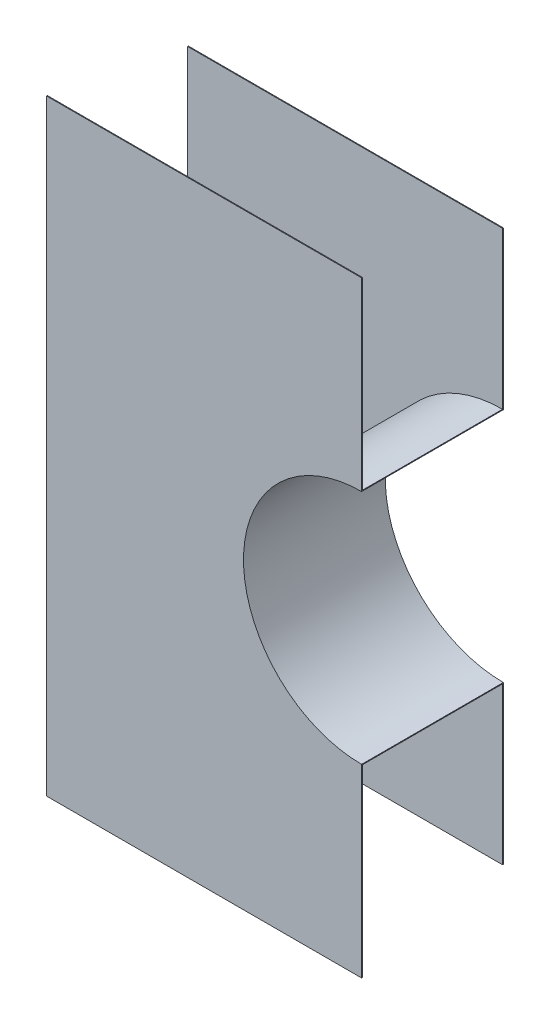
ISO-10303-21;
HEADER;
FILE_DESCRIPTION(('STEP AP214'),'2;1');
FILE_NAME('part.step','',(''),(''),'','','');
FILE_SCHEMA(('AUTOMOTIVE_DESIGN { 1 0 10303 214 1 1 1 1 }'));
ENDSEC;
DATA;
#1=APPLICATION_CONTEXT('core data for automotive mechanical design processes');
#2=APPLICATION_PROTOCOL_DEFINITION('international standard','automotive_design',2000,#1);
#3=PRODUCT_CONTEXT('',#1,'mechanical');
#4=PRODUCT('Part','Part','',(#3));
#5=PRODUCT_RELATED_PRODUCT_CATEGORY('part','',(#4));
#6=PRODUCT_DEFINITION_FORMATION('','',#4);
#7=PRODUCT_DEFINITION_CONTEXT('part definition',#1,'design');
#8=PRODUCT_DEFINITION('design','',#6,#7);
#9=PRODUCT_DEFINITION_SHAPE('','',#8);
#10=(LENGTH_UNIT() NAMED_UNIT(*) SI_UNIT(.MILLI.,.METRE.));
#11=(NAMED_UNIT(*) PLANE_ANGLE_UNIT() SI_UNIT($,.RADIAN.));
#12=(NAMED_UNIT(*) SI_UNIT($,.STERADIAN.) SOLID_ANGLE_UNIT());
#13=UNCERTAINTY_MEASURE_WITH_UNIT(LENGTH_MEASURE(1.E-05),#10,'distance_accuracy_value','');
#14=(GEOMETRIC_REPRESENTATION_CONTEXT(3) GLOBAL_UNCERTAINTY_ASSIGNED_CONTEXT((#13)) GLOBAL_UNIT_ASSIGNED_CONTEXT((#10,
#11,#12)) REPRESENTATION_CONTEXT('',''));
#15=CARTESIAN_POINT('',(0.,0.,0.));
#16=DIRECTION('',(0.,0.,1.));
#17=DIRECTION('',(1.,0.,0.));
#18=AXIS2_PLACEMENT_3D('',#15,#16,#17);
#19=CARTESIAN_POINT('',(-0.009636568954392,0.,0.18));
#20=DIRECTION('',(0.,0.,1.));
#21=DIRECTION('',(1.,0.,0.));
#22=AXIS2_PLACEMENT_3D('',#19,#20,#21);
#23=PLANE('',#22);
#24=DIRECTION('',(-1.,0.,0.));
#25=VECTOR('',#24,1.);
#26=CARTESIAN_POINT('',(-0.2,0.385,0.18));
#27=LINE('',#26,#25);
#28=CARTESIAN_POINT('',(0.2,0.385,0.18));
#29=VERTEX_POINT('',#28);
#30=CARTESIAN_POINT('',(-0.2,0.385,0.18));
#31=VERTEX_POINT('',#30);
#32=EDGE_CURVE('E257',#29,#31,#27,.T.);
#33=ORIENTED_EDGE('',*,*,#32,.T.);
#34=DIRECTION('',(0.,-1.,0.));
#35=VECTOR('',#34,1.);
#36=CARTESIAN_POINT('',(-0.2,-0.385,0.18));
#37=LINE('',#36,#35);
#38=CARTESIAN_POINT('',(-0.2,-0.385,0.18));
#39=VERTEX_POINT('',#38);
#40=EDGE_CURVE('E11',#31,#39,#37,.T.);
#41=ORIENTED_EDGE('',*,*,#40,.T.);
#42=DIRECTION('',(1.,0.,0.));
#43=VECTOR('',#42,1.);
#44=CARTESIAN_POINT('',(0.2,-0.385,0.18));
#45=LINE('',#44,#43);
#46=CARTESIAN_POINT('',(0.2,-0.385,0.18));
#47=VERTEX_POINT('',#46);
#48=EDGE_CURVE('E263',#39,#47,#45,.T.);
#49=ORIENTED_EDGE('',*,*,#48,.T.);
#50=DIRECTION('',(0.,1.,0.));
#51=VECTOR('',#50,1.);
#52=CARTESIAN_POINT('',(0.2,-0.15,0.18));
#53=LINE('',#52,#51);
#54=CARTESIAN_POINT('',(0.2,-0.15,0.18));
#55=VERTEX_POINT('',#54);
#56=EDGE_CURVE('E208',#47,#55,#53,.T.);
#57=ORIENTED_EDGE('',*,*,#56,.T.);
#58=CARTESIAN_POINT('',(0.2,0.,0.18));
#59=DIRECTION('',(0.,0.,-1.));
#60=DIRECTION('',(0.,1.,0.));
#61=AXIS2_PLACEMENT_3D('',#58,#59,#60);
#62=CIRCLE('',#61,0.15);
#63=CARTESIAN_POINT('',(0.2,0.15,0.18));
#64=VERTEX_POINT('',#63);
#65=EDGE_CURVE('E260',#55,#64,#62,.T.);
#66=ORIENTED_EDGE('',*,*,#65,.T.);
#67=DIRECTION('',(0.,1.,0.));
#68=VECTOR('',#67,1.);
#69=CARTESIAN_POINT('',(0.2,0.385,0.18));
#70=LINE('',#69,#68);
#71=EDGE_CURVE('E178',#64,#29,#70,.T.);
#72=ORIENTED_EDGE('',*,*,#71,.T.);
#73=EDGE_LOOP('',(#33,#41,#49,#57,#66,#72));
#74=FACE_BOUND('',#73,.T.);
#75=ADVANCED_FACE('F17',(#74),#23,.T.);
#76=CARTESIAN_POINT('',(-0.2,0.385,0.));
#77=DIRECTION('',(-1.,0.,0.));
#78=DIRECTION('',(0.,1.,0.));
#79=AXIS2_PLACEMENT_3D('',#76,#77,#78);
#80=PLANE('',#79);
#81=DIRECTION('',(0.,-1.,0.));
#82=VECTOR('',#81,1.);
#83=CARTESIAN_POINT('',(-0.2,0.1925,0.179));
#84=LINE('',#83,#82);
#85=CARTESIAN_POINT('',(-0.2,0.385,0.179));
#86=VERTEX_POINT('',#85);
#87=CARTESIAN_POINT('',(-0.2,-0.385,0.179));
#88=VERTEX_POINT('',#87);
#89=EDGE_CURVE('E241',#86,#88,#84,.T.);
#90=ORIENTED_EDGE('',*,*,#89,.T.);
#91=DIRECTION('',(0.,0.,1.));
#92=VECTOR('',#91,1.);
#93=CARTESIAN_POINT('',(-0.2,-0.385,0.));
#94=LINE('',#93,#92);
#95=EDGE_CURVE('E25',#88,#39,#94,.T.);
#96=ORIENTED_EDGE('',*,*,#95,.T.);
#97=ORIENTED_EDGE('',*,*,#40,.F.);
#98=DIRECTION('',(0.,0.,1.));
#99=VECTOR('',#98,1.);
#100=CARTESIAN_POINT('',(-0.2,0.385,0.));
#101=LINE('',#100,#99);
#102=EDGE_CURVE('E253',#86,#31,#101,.T.);
#103=ORIENTED_EDGE('',*,*,#102,.F.);
#104=EDGE_LOOP('',(#90,#96,#97,#103));
#105=FACE_BOUND('',#104,.T.);
#106=ADVANCED_FACE('F269',(#105),#80,.T.);
#107=CARTESIAN_POINT('',(-0.2,-0.385,0.));
#108=DIRECTION('',(0.,-1.,0.));
#109=DIRECTION('',(0.,0.,-1.));
#110=AXIS2_PLACEMENT_3D('',#107,#108,#109);
#111=PLANE('',#110);
#112=DIRECTION('',(1.,0.,0.));
#113=VECTOR('',#112,1.);
#114=CARTESIAN_POINT('',(-0.104818284477,-0.385,0.179));
#115=LINE('',#114,#113);
#116=CARTESIAN_POINT('',(0.2,-0.385,0.179));
#117=VERTEX_POINT('',#116);
#118=EDGE_CURVE('E238',#88,#117,#115,.T.);
#119=ORIENTED_EDGE('',*,*,#118,.T.);
#120=DIRECTION('',(0.,0.,1.));
#121=VECTOR('',#120,1.);
#122=CARTESIAN_POINT('',(0.2,-0.385,0.));
#123=LINE('',#122,#121);
#124=EDGE_CURVE('E220',#117,#47,#123,.T.);
#125=ORIENTED_EDGE('',*,*,#124,.T.);
#126=ORIENTED_EDGE('',*,*,#48,.F.);
#127=ORIENTED_EDGE('',*,*,#95,.F.);
#128=EDGE_LOOP('',(#119,#125,#126,#127));
#129=FACE_BOUND('',#128,.T.);
#130=ADVANCED_FACE('F273',(#129),#111,.T.);
#131=CARTESIAN_POINT('',(0.2,0.,0.));
#132=DIRECTION('',(0.,0.,1.));
#133=DIRECTION('',(0.,1.,0.));
#134=AXIS2_PLACEMENT_3D('',#131,#132,#133);
#135=CYLINDRICAL_SURFACE('',#134,0.15);
#136=CARTESIAN_POINT('',(0.2,0.,0.));
#137=DIRECTION('',(0.,0.,1.));
#138=DIRECTION('',(0.,1.,0.));
#139=AXIS2_PLACEMENT_3D('',#136,#137,#138);
#140=CIRCLE('',#139,0.15);
#141=CARTESIAN_POINT('',(0.2,0.15,0.));
#142=VERTEX_POINT('',#141);
#143=CARTESIAN_POINT('',(0.2,-0.15,0.));
#144=VERTEX_POINT('',#143);
#145=EDGE_CURVE('E235',#142,#144,#140,.T.);
#146=ORIENTED_EDGE('',*,*,#145,.F.);
#147=DIRECTION('',(0.,0.,1.));
#148=VECTOR('',#147,1.);
#149=CARTESIAN_POINT('',(0.2,0.15,0.));
#150=LINE('',#149,#148);
#151=EDGE_CURVE('E140',#142,#64,#150,.T.);
#152=ORIENTED_EDGE('',*,*,#151,.T.);
#153=ORIENTED_EDGE('',*,*,#65,.F.);
#154=DIRECTION('',(0.,0.,1.));
#155=VECTOR('',#154,1.);
#156=CARTESIAN_POINT('',(0.2,-0.15,0.));
#157=LINE('',#156,#155);
#158=EDGE_CURVE('E204',#144,#55,#157,.T.);
#159=ORIENTED_EDGE('',*,*,#158,.F.);
#160=EDGE_LOOP('',(#146,#152,#153,#159));
#161=FACE_BOUND('',#160,.T.);
#162=ADVANCED_FACE('F282',(#161),#135,.F.);
#163=CARTESIAN_POINT('',(-0.2,0.385,0.));
#164=DIRECTION('',(-1.,0.,0.));
#165=DIRECTION('',(0.,1.,0.));
#166=AXIS2_PLACEMENT_3D('',#163,#164,#165);
#167=PLANE('',#166);
#168=DIRECTION('',(0.,0.,-1.));
#169=VECTOR('',#168,1.);
#170=CARTESIAN_POINT('',(-0.2,0.35,0.));
#171=LINE('',#170,#169);
#172=CARTESIAN_POINT('',(-0.2,0.35,0.001));
#173=VERTEX_POINT('',#172);
#174=CARTESIAN_POINT('',(-0.2,0.35,0.));
#175=VERTEX_POINT('',#174);
#176=EDGE_CURVE('E154',#173,#175,#171,.T.);
#177=ORIENTED_EDGE('',*,*,#176,.T.);
#178=DIRECTION('',(0.,1.,0.));
#179=VECTOR('',#178,1.);
#180=CARTESIAN_POINT('',(-0.2,-0.385,0.));
#181=LINE('',#180,#179);
#182=CARTESIAN_POINT('',(-0.2,-0.35,0.));
#183=VERTEX_POINT('',#182);
#184=EDGE_CURVE('E149',#183,#175,#181,.T.);
#185=ORIENTED_EDGE('',*,*,#184,.F.);
#186=DIRECTION('',(0.,0.,1.));
#187=VECTOR('',#186,1.);
#188=CARTESIAN_POINT('',(-0.2,-0.35,0.));
#189=LINE('',#188,#187);
#190=CARTESIAN_POINT('',(-0.2,-0.35,0.001));
#191=VERTEX_POINT('',#190);
#192=EDGE_CURVE('E172',#183,#191,#189,.T.);
#193=ORIENTED_EDGE('',*,*,#192,.T.);
#194=DIRECTION('',(0.,1.,0.));
#195=VECTOR('',#194,1.);
#196=CARTESIAN_POINT('',(-0.2,0.1925,0.001));
#197=LINE('',#196,#195);
#198=EDGE_CURVE('E192',#191,#173,#197,.T.);
#199=ORIENTED_EDGE('',*,*,#198,.T.);
#200=EDGE_LOOP('',(#177,#185,#193,#199));
#201=FACE_BOUND('',#200,.T.);
#202=ADVANCED_FACE('F466',(#201),#167,.T.);
#203=CARTESIAN_POINT('',(0.2,0.385,0.));
#204=DIRECTION('',(0.,1.,0.));
#205=DIRECTION('',(1.,0.,0.));
#206=AXIS2_PLACEMENT_3D('',#203,#204,#205);
#207=PLANE('',#206);
#208=DIRECTION('',(-1.,0.,0.));
#209=VECTOR('',#208,1.);
#210=CARTESIAN_POINT('',(0.0951817155228,0.385,0.179));
#211=LINE('',#210,#209);
#212=CARTESIAN_POINT('',(0.2,0.385,0.179));
#213=VERTEX_POINT('',#212);
#214=EDGE_CURVE('E195',#213,#86,#211,.T.);
#215=ORIENTED_EDGE('',*,*,#214,.T.);
#216=ORIENTED_EDGE('',*,*,#102,.T.);
#217=ORIENTED_EDGE('',*,*,#32,.F.);
#218=DIRECTION('',(0.,0.,1.));
#219=VECTOR('',#218,1.);
#220=CARTESIAN_POINT('',(0.2,0.385,0.));
#221=LINE('',#220,#219);
#222=EDGE_CURVE('E174',#213,#29,#221,.T.);
#223=ORIENTED_EDGE('',*,*,#222,.F.);
#224=EDGE_LOOP('',(#215,#216,#217,#223));
#225=FACE_BOUND('',#224,.T.);
#226=ADVANCED_FACE('F440',(#225),#207,.T.);
#227=CARTESIAN_POINT('',(-0.009636568954392,0.,0.179));
#228=DIRECTION('',(0.,0.,1.));
#229=DIRECTION('',(1.,0.,0.));
#230=AXIS2_PLACEMENT_3D('',#227,#228,#229);
#231=PLANE('',#230);
#232=ORIENTED_EDGE('',*,*,#214,.F.);
#233=DIRECTION('',(0.,1.,0.));
#234=VECTOR('',#233,1.);
#235=CARTESIAN_POINT('',(0.2,0.075,0.179));
#236=LINE('',#235,#234);
#237=CARTESIAN_POINT('',(0.2,0.151,0.179));
#238=VERTEX_POINT('',#237);
#239=EDGE_CURVE('E179',#238,#213,#236,.T.);
#240=ORIENTED_EDGE('',*,*,#239,.F.);
#241=CARTESIAN_POINT('',(0.2,0.,0.179));
#242=DIRECTION('',(0.,0.,1.));
#243=DIRECTION('',(0.,1.,0.));
#244=AXIS2_PLACEMENT_3D('',#241,#242,#243);
#245=CIRCLE('',#244,0.151);
#246=CARTESIAN_POINT('',(0.2,-0.151,0.179));
#247=VERTEX_POINT('',#246);
#248=EDGE_CURVE('E167',#238,#247,#245,.T.);
#249=ORIENTED_EDGE('',*,*,#248,.T.);
#250=DIRECTION('',(0.,1.,0.));
#251=VECTOR('',#250,1.);
#252=CARTESIAN_POINT('',(0.2,-0.1925,0.179));
#253=LINE('',#252,#251);
#254=EDGE_CURVE('E224',#117,#247,#253,.T.);
#255=ORIENTED_EDGE('',*,*,#254,.F.);
#256=ORIENTED_EDGE('',*,*,#118,.F.);
#257=ORIENTED_EDGE('',*,*,#89,.F.);
#258=EDGE_LOOP('',(#232,#240,#249,#255,#256,#257));
#259=FACE_BOUND('',#258,.T.);
#260=ADVANCED_FACE('F398',(#259),#231,.F.);
#261=CARTESIAN_POINT('',(-0.009636568954392,0.,0.001));
#262=DIRECTION('',(0.,0.,1.));
#263=DIRECTION('',(1.,0.,0.));
#264=AXIS2_PLACEMENT_3D('',#261,#262,#263);
#265=PLANE('',#264);
#266=DIRECTION('',(-1.,0.,0.));
#267=VECTOR('',#266,1.);
#268=CARTESIAN_POINT('',(-0.104818284477,0.35,0.001));
#269=LINE('',#268,#267);
#270=CARTESIAN_POINT('',(0.2,0.35,0.001));
#271=VERTEX_POINT('',#270);
#272=EDGE_CURVE('E159',#271,#173,#269,.T.);
#273=ORIENTED_EDGE('',*,*,#272,.T.);
#274=ORIENTED_EDGE('',*,*,#198,.F.);
#275=DIRECTION('',(1.,0.,0.));
#276=VECTOR('',#275,1.);
#277=CARTESIAN_POINT('',(0.09959100726588,-0.35,0.001));
#278=LINE('',#277,#276);
#279=CARTESIAN_POINT('',(0.2,-0.35,0.001));
#280=VERTEX_POINT('',#279);
#281=EDGE_CURVE('E185',#191,#280,#278,.T.);
#282=ORIENTED_EDGE('',*,*,#281,.T.);
#283=DIRECTION('',(0.,-1.,0.));
#284=VECTOR('',#283,1.);
#285=CARTESIAN_POINT('',(0.2,-0.1925,0.001));
#286=LINE('',#285,#284);
#287=CARTESIAN_POINT('',(0.2,-0.151,0.001));
#288=VERTEX_POINT('',#287);
#289=EDGE_CURVE('E232',#288,#280,#286,.T.);
#290=ORIENTED_EDGE('',*,*,#289,.F.);
#291=CARTESIAN_POINT('',(0.2,0.,0.001));
#292=DIRECTION('',(0.,0.,1.));
#293=DIRECTION('',(0.,1.,0.));
#294=AXIS2_PLACEMENT_3D('',#291,#292,#293);
#295=CIRCLE('',#294,0.151);
#296=CARTESIAN_POINT('',(0.2,0.151,0.001));
#297=VERTEX_POINT('',#296);
#298=EDGE_CURVE('E244',#297,#288,#295,.T.);
#299=ORIENTED_EDGE('',*,*,#298,.F.);
#300=DIRECTION('',(0.,-1.,0.));
#301=VECTOR('',#300,1.);
#302=CARTESIAN_POINT('',(0.2,0.075,0.001));
#303=LINE('',#302,#301);
#304=EDGE_CURVE('E171',#271,#297,#303,.T.);
#305=ORIENTED_EDGE('',*,*,#304,.F.);
#306=EDGE_LOOP('',(#273,#274,#282,#290,#299,#305));
#307=FACE_BOUND('',#306,.T.);
#308=ADVANCED_FACE('F392',(#307),#265,.T.);
#309=CARTESIAN_POINT('',(0.2,0.,0.));
#310=DIRECTION('',(0.,0.,1.));
#311=DIRECTION('',(0.,1.,0.));
#312=AXIS2_PLACEMENT_3D('',#309,#310,#311);
#313=CYLINDRICAL_SURFACE('',#312,0.151);
#314=ORIENTED_EDGE('',*,*,#298,.T.);
#315=DIRECTION('',(0.,0.,-1.));
#316=VECTOR('',#315,1.);
#317=CARTESIAN_POINT('',(0.2,-0.151,0.));
#318=LINE('',#317,#316);
#319=EDGE_CURVE('E228',#247,#288,#318,.T.);
#320=ORIENTED_EDGE('',*,*,#319,.F.);
#321=ORIENTED_EDGE('',*,*,#248,.F.);
#322=DIRECTION('',(0.,0.,1.));
#323=VECTOR('',#322,1.);
#324=CARTESIAN_POINT('',(0.2,0.151,0.));
#325=LINE('',#324,#323);
#326=EDGE_CURVE('E198',#297,#238,#325,.T.);
#327=ORIENTED_EDGE('',*,*,#326,.F.);
#328=EDGE_LOOP('',(#314,#320,#321,#327));
#329=FACE_BOUND('',#328,.T.);
#330=ADVANCED_FACE('F397',(#329),#313,.T.);
#331=CARTESIAN_POINT('',(-0.009636568954392,0.,0.));
#332=DIRECTION('',(0.,0.,1.));
#333=DIRECTION('',(1.,0.,0.));
#334=AXIS2_PLACEMENT_3D('',#331,#332,#333);
#335=PLANE('',#334);
#336=DIRECTION('',(1.,0.,0.));
#337=VECTOR('',#336,1.);
#338=CARTESIAN_POINT('',(-0.104818284477,0.35,0.));
#339=LINE('',#338,#337);
#340=CARTESIAN_POINT('',(0.2,0.35,0.));
#341=VERTEX_POINT('',#340);
#342=EDGE_CURVE('E146',#175,#341,#339,.T.);
#343=ORIENTED_EDGE('',*,*,#342,.T.);
#344=DIRECTION('',(0.,-1.,0.));
#345=VECTOR('',#344,1.);
#346=CARTESIAN_POINT('',(0.2,0.385,0.));
#347=LINE('',#346,#345);
#348=EDGE_CURVE('E132',#341,#142,#347,.T.);
#349=ORIENTED_EDGE('',*,*,#348,.T.);
#350=ORIENTED_EDGE('',*,*,#145,.T.);
#351=DIRECTION('',(0.,-1.,0.));
#352=VECTOR('',#351,1.);
#353=CARTESIAN_POINT('',(0.2,-0.15,0.));
#354=LINE('',#353,#352);
#355=CARTESIAN_POINT('',(0.2,-0.35,0.));
#356=VERTEX_POINT('',#355);
#357=EDGE_CURVE('E143',#144,#356,#354,.T.);
#358=ORIENTED_EDGE('',*,*,#357,.T.);
#359=DIRECTION('',(-1.,0.,0.));
#360=VECTOR('',#359,1.);
#361=CARTESIAN_POINT('',(0.09959100726588,-0.35,0.));
#362=LINE('',#361,#360);
#363=EDGE_CURVE('E169',#356,#183,#362,.T.);
#364=ORIENTED_EDGE('',*,*,#363,.T.);
#365=ORIENTED_EDGE('',*,*,#184,.T.);
#366=EDGE_LOOP('',(#343,#349,#350,#358,#364,#365));
#367=FACE_BOUND('',#366,.T.);
#368=ADVANCED_FACE('F147',(#367),#335,.F.);
#369=CARTESIAN_POINT('',(0.2,-0.385,0.));
#370=DIRECTION('',(1.,0.,0.));
#371=DIRECTION('',(0.,1.,0.));
#372=AXIS2_PLACEMENT_3D('',#369,#370,#371);
#373=PLANE('',#372);
#374=DIRECTION('',(0.,0.,-1.));
#375=VECTOR('',#374,1.);
#376=CARTESIAN_POINT('',(0.2,-0.35,0.));
#377=LINE('',#376,#375);
#378=EDGE_CURVE('E188',#280,#356,#377,.T.);
#379=ORIENTED_EDGE('',*,*,#378,.T.);
#380=ORIENTED_EDGE('',*,*,#357,.F.);
#381=ORIENTED_EDGE('',*,*,#158,.T.);
#382=ORIENTED_EDGE('',*,*,#56,.F.);
#383=ORIENTED_EDGE('',*,*,#124,.F.);
#384=ORIENTED_EDGE('',*,*,#254,.T.);
#385=ORIENTED_EDGE('',*,*,#319,.T.);
#386=ORIENTED_EDGE('',*,*,#289,.T.);
#387=EDGE_LOOP('',(#379,#380,#381,#382,#383,#384,#385,#386));
#388=FACE_BOUND('',#387,.T.);
#389=ADVANCED_FACE('F280',(#388),#373,.T.);
#390=CARTESIAN_POINT('',(0.2,0.15,0.));
#391=DIRECTION('',(1.,0.,0.));
#392=DIRECTION('',(0.,1.,0.));
#393=AXIS2_PLACEMENT_3D('',#390,#391,#392);
#394=PLANE('',#393);
#395=DIRECTION('',(0.,0.,1.));
#396=VECTOR('',#395,1.);
#397=CARTESIAN_POINT('',(0.2,0.35,0.));
#398=LINE('',#397,#396);
#399=EDGE_CURVE('E137',#341,#271,#398,.T.);
#400=ORIENTED_EDGE('',*,*,#399,.T.);
#401=ORIENTED_EDGE('',*,*,#304,.T.);
#402=ORIENTED_EDGE('',*,*,#326,.T.);
#403=ORIENTED_EDGE('',*,*,#239,.T.);
#404=ORIENTED_EDGE('',*,*,#222,.T.);
#405=ORIENTED_EDGE('',*,*,#71,.F.);
#406=ORIENTED_EDGE('',*,*,#151,.F.);
#407=ORIENTED_EDGE('',*,*,#348,.F.);
#408=EDGE_LOOP('',(#400,#401,#402,#403,#404,#405,#406,#407));
#409=FACE_BOUND('',#408,.T.);
#410=ADVANCED_FACE('F134',(#409),#394,.T.);
#411=CARTESIAN_POINT('',(0.208818583486,-0.35,0.));
#412=DIRECTION('',(0.,1.,0.));
#413=DIRECTION('',(1.,0.,0.));
#414=AXIS2_PLACEMENT_3D('',#411,#412,#413);
#415=PLANE('',#414);
#416=ORIENTED_EDGE('',*,*,#378,.F.);
#417=ORIENTED_EDGE('',*,*,#281,.F.);
#418=ORIENTED_EDGE('',*,*,#192,.F.);
#419=ORIENTED_EDGE('',*,*,#363,.F.);
#420=EDGE_LOOP('',(#416,#417,#418,#419));
#421=FACE_BOUND('',#420,.T.);
#422=ADVANCED_FACE('F409',(#421),#415,.F.);
#423=CARTESIAN_POINT('',(-0.2,0.35,0.));
#424=DIRECTION('',(0.,-1.,0.));
#425=DIRECTION('',(-1.,0.,0.));
#426=AXIS2_PLACEMENT_3D('',#423,#424,#425);
#427=PLANE('',#426);
#428=ORIENTED_EDGE('',*,*,#399,.F.);
#429=ORIENTED_EDGE('',*,*,#342,.F.);
#430=ORIENTED_EDGE('',*,*,#176,.F.);
#431=ORIENTED_EDGE('',*,*,#272,.F.);
#432=EDGE_LOOP('',(#428,#429,#430,#431));
#433=FACE_BOUND('',#432,.T.);
#434=ADVANCED_FACE('F157',(#433),#427,.F.);
#435=CLOSED_SHELL('',(#75,#106,#130,#162,#202,#226,#260,#308,#330,#368,#389,#410,#422,#434));
#436=MANIFOLD_SOLID_BREP('B1',#435);
#437=ADVANCED_BREP_SHAPE_REPRESENTATION('',(#18,#436),#14);
#438=SHAPE_DEFINITION_REPRESENTATION(#9,#437);
ENDSEC;
END-ISO-10303-21;
